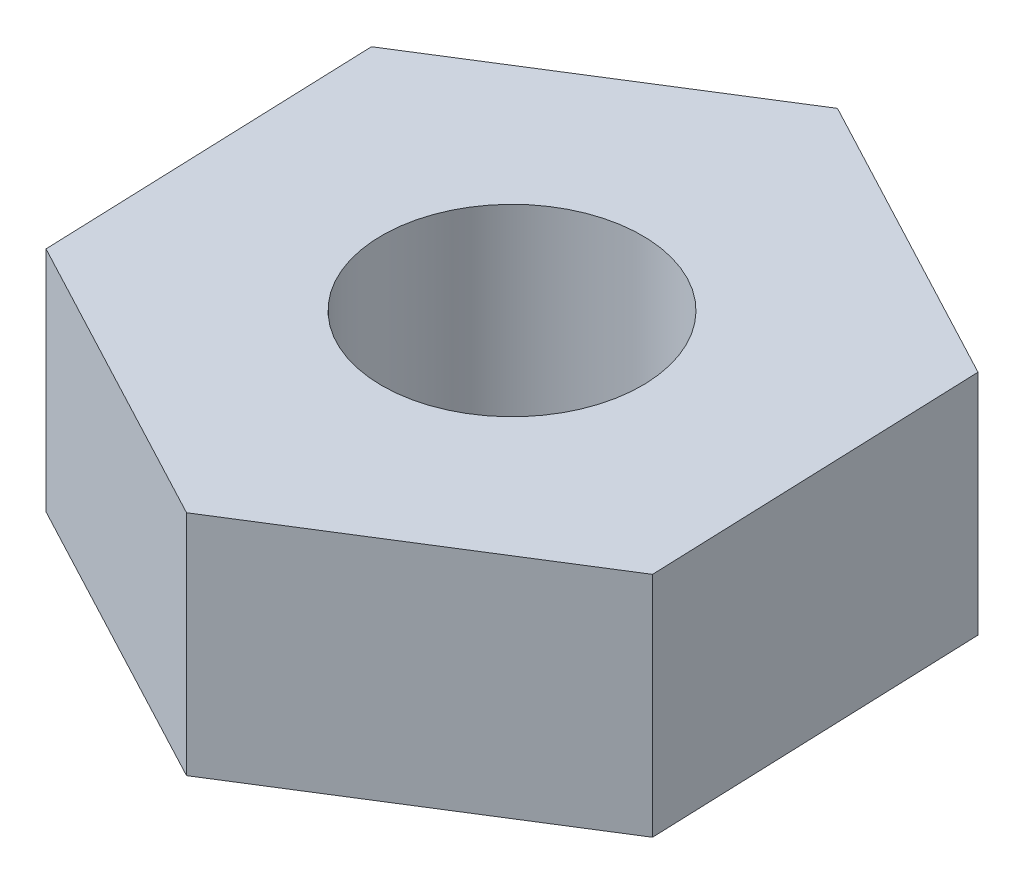
ISO-10303-21;
HEADER;
FILE_DESCRIPTION(('STEP AP214'),'2;1');
FILE_NAME('part.step','',(''),(''),'','','');
FILE_SCHEMA(('AUTOMOTIVE_DESIGN { 1 0 10303 214 1 1 1 1 }'));
ENDSEC;
DATA;
#1=APPLICATION_CONTEXT('core data for automotive mechanical design processes');
#2=APPLICATION_PROTOCOL_DEFINITION('international standard','automotive_design',2000,#1);
#3=PRODUCT_CONTEXT('',#1,'mechanical');
#4=PRODUCT('Part','Part','',(#3));
#5=PRODUCT_RELATED_PRODUCT_CATEGORY('part','',(#4));
#6=PRODUCT_DEFINITION_FORMATION('','',#4);
#7=PRODUCT_DEFINITION_CONTEXT('part definition',#1,'design');
#8=PRODUCT_DEFINITION('design','',#6,#7);
#9=PRODUCT_DEFINITION_SHAPE('','',#8);
#10=(LENGTH_UNIT() NAMED_UNIT(*) SI_UNIT(.MILLI.,.METRE.));
#11=(NAMED_UNIT(*) PLANE_ANGLE_UNIT() SI_UNIT($,.RADIAN.));
#12=(NAMED_UNIT(*) SI_UNIT($,.STERADIAN.) SOLID_ANGLE_UNIT());
#13=UNCERTAINTY_MEASURE_WITH_UNIT(LENGTH_MEASURE(1.E-05),#10,'distance_accuracy_value','');
#14=(GEOMETRIC_REPRESENTATION_CONTEXT(3) GLOBAL_UNCERTAINTY_ASSIGNED_CONTEXT((#13)) GLOBAL_UNIT_ASSIGNED_CONTEXT((#10,
#11,#12)) REPRESENTATION_CONTEXT('',''));
#15=CARTESIAN_POINT('',(0.,0.,0.));
#16=DIRECTION('',(0.,0.,1.));
#17=DIRECTION('',(1.,0.,0.));
#18=AXIS2_PLACEMENT_3D('',#15,#16,#17);
#19=CARTESIAN_POINT('',(0.,1.75,0.));
#20=DIRECTION('',(0.,1.,0.));
#21=DIRECTION('',(0.,0.,1.));
#22=AXIS2_PLACEMENT_3D('',#19,#20,#21);
#23=PLANE('',#22);
#24=DIRECTION('',(0.847163633687785,0.,-0.53133207860707));
#25=VECTOR('',#24,1.);
#26=CARTESIAN_POINT('',(0.0949993349619725,1.75,2.59633879267648));
#27=LINE('',#26,#25);
#28=CARTESIAN_POINT('',(0.0949993349619725,1.75,2.59633879267648));
#29=VERTEX_POINT('',#28);
#30=CARTESIAN_POINT('',(2.29599501876984,1.75,1.21589755891855));
#31=VERTEX_POINT('',#30);
#32=EDGE_CURVE('E100',#29,#31,#27,.T.);
#33=ORIENTED_EDGE('',*,*,#32,.T.);
#34=DIRECTION('',(-0.0365652610754204,0.,-0.999331267239491));
#35=VECTOR('',#34,1.);
#36=CARTESIAN_POINT('',(2.29599501876984,1.75,1.21589755891855));
#37=LINE('',#36,#35);
#38=CARTESIAN_POINT('',(2.20099568380787,1.75,-1.38044123375794));
#39=VERTEX_POINT('',#38);
#40=EDGE_CURVE('E53',#31,#39,#37,.T.);
#41=ORIENTED_EDGE('',*,*,#40,.T.);
#42=DIRECTION('',(-0.883728894763205,0.,-0.467999188632421));
#43=VECTOR('',#42,1.);
#44=CARTESIAN_POINT('',(2.20099568380787,1.75,-1.38044123375794));
#45=LINE('',#44,#43);
#46=CARTESIAN_POINT('',(-0.0949993349619726,1.75,-2.59633879267648));
#47=VERTEX_POINT('',#46);
#48=EDGE_CURVE('E88',#39,#47,#45,.T.);
#49=ORIENTED_EDGE('',*,*,#48,.T.);
#50=DIRECTION('',(-0.847163633687784,0.,0.53133207860707));
#51=VECTOR('',#50,1.);
#52=CARTESIAN_POINT('',(-0.0949993349619726,1.75,-2.59633879267648));
#53=LINE('',#52,#51);
#54=CARTESIAN_POINT('',(-2.29599501876984,1.75,-1.21589755891855));
#55=VERTEX_POINT('',#54);
#56=EDGE_CURVE('E219',#47,#55,#53,.T.);
#57=ORIENTED_EDGE('',*,*,#56,.T.);
#58=DIRECTION('',(0.0365652610754201,0.,0.999331267239491));
#59=VECTOR('',#58,1.);
#60=CARTESIAN_POINT('',(-2.29599501876984,1.75,-1.21589755891855));
#61=LINE('',#60,#59);
#62=CARTESIAN_POINT('',(-2.20099568380787,1.75,1.38044123375794));
#63=VERTEX_POINT('',#62);
#64=EDGE_CURVE('E102',#55,#63,#61,.T.);
#65=ORIENTED_EDGE('',*,*,#64,.T.);
#66=DIRECTION('',(0.883728894763205,0.,0.467999188632421));
#67=VECTOR('',#66,1.);
#68=CARTESIAN_POINT('',(-2.20099568380787,1.75,1.38044123375794));
#69=LINE('',#68,#67);
#70=EDGE_CURVE('E96',#63,#29,#69,.T.);
#71=ORIENTED_EDGE('',*,*,#70,.T.);
#72=EDGE_LOOP('',(#33,#41,#49,#57,#65,#71));
#73=FACE_BOUND('',#72,.T.);
#74=CARTESIAN_POINT('',(0.,1.75,0.));
#75=DIRECTION('',(0.,1.,0.));
#76=DIRECTION('',(0.,0.,1.));
#77=AXIS2_PLACEMENT_3D('',#74,#75,#76);
#78=CIRCLE('',#77,1.);
#79=CARTESIAN_POINT('',(0.,1.75,1.));
#80=VERTEX_POINT('',#79);
#81=EDGE_CURVE('E124',#80,#80,#78,.T.);
#82=ORIENTED_EDGE('',*,*,#81,.F.);
#83=EDGE_LOOP('',(#82));
#84=FACE_BOUND('',#83,.T.);
#85=ADVANCED_FACE('F36',(#73,#84),#23,.T.);
#86=CARTESIAN_POINT('',(0.,0.,0.));
#87=DIRECTION('',(0.,1.,0.));
#88=DIRECTION('',(0.,0.,1.));
#89=AXIS2_PLACEMENT_3D('',#86,#87,#88);
#90=PLANE('',#89);
#91=DIRECTION('',(-0.883728894763205,0.,-0.467999188632421));
#92=VECTOR('',#91,1.);
#93=CARTESIAN_POINT('',(2.20099568380787,0.,-1.38044123375794));
#94=LINE('',#93,#92);
#95=CARTESIAN_POINT('',(2.20099568380787,0.,-1.38044123375794));
#96=VERTEX_POINT('',#95);
#97=CARTESIAN_POINT('',(-0.0949993349619726,0.,-2.59633879267648));
#98=VERTEX_POINT('',#97);
#99=EDGE_CURVE('E120',#96,#98,#94,.T.);
#100=ORIENTED_EDGE('',*,*,#99,.F.);
#101=DIRECTION('',(-0.0365652610754204,0.,-0.999331267239491));
#102=VECTOR('',#101,1.);
#103=CARTESIAN_POINT('',(2.29599501876984,0.,1.21589755891855));
#104=LINE('',#103,#102);
#105=CARTESIAN_POINT('',(2.29599501876984,0.,1.21589755891855));
#106=VERTEX_POINT('',#105);
#107=EDGE_CURVE('E82',#106,#96,#104,.T.);
#108=ORIENTED_EDGE('',*,*,#107,.F.);
#109=DIRECTION('',(0.847163633687785,0.,-0.53133207860707));
#110=VECTOR('',#109,1.);
#111=CARTESIAN_POINT('',(0.0949993349619725,0.,2.59633879267648));
#112=LINE('',#111,#110);
#113=CARTESIAN_POINT('',(0.0949993349619725,0.,2.59633879267648));
#114=VERTEX_POINT('',#113);
#115=EDGE_CURVE('E76',#114,#106,#112,.T.);
#116=ORIENTED_EDGE('',*,*,#115,.F.);
#117=DIRECTION('',(0.883728894763205,0.,0.467999188632421));
#118=VECTOR('',#117,1.);
#119=CARTESIAN_POINT('',(-2.20099568380787,0.,1.38044123375794));
#120=LINE('',#119,#118);
#121=CARTESIAN_POINT('',(-2.20099568380787,0.,1.38044123375794));
#122=VERTEX_POINT('',#121);
#123=EDGE_CURVE('E110',#122,#114,#120,.T.);
#124=ORIENTED_EDGE('',*,*,#123,.F.);
#125=DIRECTION('',(0.0365652610754201,0.,0.999331267239491));
#126=VECTOR('',#125,1.);
#127=CARTESIAN_POINT('',(-2.29599501876984,0.,-1.21589755891855));
#128=LINE('',#127,#126);
#129=CARTESIAN_POINT('',(-2.29599501876984,0.,-1.21589755891855));
#130=VERTEX_POINT('',#129);
#131=EDGE_CURVE('E126',#130,#122,#128,.T.);
#132=ORIENTED_EDGE('',*,*,#131,.F.);
#133=DIRECTION('',(-0.847163633687784,0.,0.53133207860707));
#134=VECTOR('',#133,1.);
#135=CARTESIAN_POINT('',(-0.0949993349619726,0.,-2.59633879267648));
#136=LINE('',#135,#134);
#137=EDGE_CURVE('E123',#98,#130,#136,.T.);
#138=ORIENTED_EDGE('',*,*,#137,.F.);
#139=EDGE_LOOP('',(#100,#108,#116,#124,#132,#138));
#140=FACE_BOUND('',#139,.T.);
#141=CARTESIAN_POINT('',(0.,0.,0.));
#142=DIRECTION('',(0.,1.,0.));
#143=DIRECTION('',(0.,0.,1.));
#144=AXIS2_PLACEMENT_3D('',#141,#142,#143);
#145=CIRCLE('',#144,1.);
#146=CARTESIAN_POINT('',(0.,0.,1.));
#147=VERTEX_POINT('',#146);
#148=EDGE_CURVE('E223',#147,#147,#145,.T.);
#149=ORIENTED_EDGE('',*,*,#148,.T.);
#150=EDGE_LOOP('',(#149));
#151=FACE_BOUND('',#150,.T.);
#152=ADVANCED_FACE('F141',(#140,#151),#90,.F.);
#153=CARTESIAN_POINT('',(2.20099568380787,1.75,-1.38044123375794));
#154=DIRECTION('',(-0.467999188632421,0.,0.883728894763205));
#155=DIRECTION('',(0.883728894763205,0.,0.467999188632421));
#156=AXIS2_PLACEMENT_3D('',#153,#154,#155);
#157=PLANE('',#156);
#158=ORIENTED_EDGE('',*,*,#99,.T.);
#159=DIRECTION('',(0.,-1.,0.));
#160=VECTOR('',#159,1.);
#161=CARTESIAN_POINT('',(-0.0949993349619726,1.75,-2.59633879267648));
#162=LINE('',#161,#160);
#163=EDGE_CURVE('E11',#47,#98,#162,.T.);
#164=ORIENTED_EDGE('',*,*,#163,.F.);
#165=ORIENTED_EDGE('',*,*,#48,.F.);
#166=DIRECTION('',(0.,-1.,0.));
#167=VECTOR('',#166,1.);
#168=CARTESIAN_POINT('',(2.20099568380787,1.75,-1.38044123375794));
#169=LINE('',#168,#167);
#170=EDGE_CURVE('E116',#39,#96,#169,.T.);
#171=ORIENTED_EDGE('',*,*,#170,.T.);
#172=EDGE_LOOP('',(#158,#164,#165,#171));
#173=FACE_BOUND('',#172,.T.);
#174=ADVANCED_FACE('F38',(#173),#157,.F.);
#175=CARTESIAN_POINT('',(-0.0949993349619726,1.75,-2.59633879267648));
#176=DIRECTION('',(0.53133207860707,0.,0.847163633687785));
#177=DIRECTION('',(0.847163633687785,0.,-0.53133207860707));
#178=AXIS2_PLACEMENT_3D('',#175,#176,#177);
#179=PLANE('',#178);
#180=ORIENTED_EDGE('',*,*,#137,.T.);
#181=DIRECTION('',(0.,-1.,0.));
#182=VECTOR('',#181,1.);
#183=CARTESIAN_POINT('',(-2.29599501876984,1.75,-1.21589755891855));
#184=LINE('',#183,#182);
#185=EDGE_CURVE('E45',#55,#130,#184,.T.);
#186=ORIENTED_EDGE('',*,*,#185,.F.);
#187=ORIENTED_EDGE('',*,*,#56,.F.);
#188=ORIENTED_EDGE('',*,*,#163,.T.);
#189=EDGE_LOOP('',(#180,#186,#187,#188));
#190=FACE_BOUND('',#189,.T.);
#191=ADVANCED_FACE('F165',(#190),#179,.F.);
#192=CARTESIAN_POINT('',(-2.29599501876984,1.75,-1.21589755891855));
#193=DIRECTION('',(0.999331267239491,0.,-0.0365652610754201));
#194=DIRECTION('',(-0.0365652610754201,0.,-0.999331267239491));
#195=AXIS2_PLACEMENT_3D('',#192,#193,#194);
#196=PLANE('',#195);
#197=ORIENTED_EDGE('',*,*,#131,.T.);
#198=DIRECTION('',(0.,-1.,0.));
#199=VECTOR('',#198,1.);
#200=CARTESIAN_POINT('',(-2.20099568380787,1.75,1.38044123375794));
#201=LINE('',#200,#199);
#202=EDGE_CURVE('E111',#63,#122,#201,.T.);
#203=ORIENTED_EDGE('',*,*,#202,.F.);
#204=ORIENTED_EDGE('',*,*,#64,.F.);
#205=ORIENTED_EDGE('',*,*,#185,.T.);
#206=EDGE_LOOP('',(#197,#203,#204,#205));
#207=FACE_BOUND('',#206,.T.);
#208=ADVANCED_FACE('F137',(#207),#196,.F.);
#209=CARTESIAN_POINT('',(-2.20099568380787,1.75,1.38044123375794));
#210=DIRECTION('',(0.467999188632421,0.,-0.883728894763205));
#211=DIRECTION('',(-0.883728894763205,0.,-0.467999188632421));
#212=AXIS2_PLACEMENT_3D('',#209,#210,#211);
#213=PLANE('',#212);
#214=ORIENTED_EDGE('',*,*,#123,.T.);
#215=DIRECTION('',(0.,-1.,0.));
#216=VECTOR('',#215,1.);
#217=CARTESIAN_POINT('',(0.0949993349619725,1.75,2.59633879267648));
#218=LINE('',#217,#216);
#219=EDGE_CURVE('E107',#29,#114,#218,.T.);
#220=ORIENTED_EDGE('',*,*,#219,.F.);
#221=ORIENTED_EDGE('',*,*,#70,.F.);
#222=ORIENTED_EDGE('',*,*,#202,.T.);
#223=EDGE_LOOP('',(#214,#220,#221,#222));
#224=FACE_BOUND('',#223,.T.);
#225=ADVANCED_FACE('F108',(#224),#213,.F.);
#226=CARTESIAN_POINT('',(0.0949993349619725,1.75,2.59633879267648));
#227=DIRECTION('',(-0.531332078607069,0.,-0.847163633687785));
#228=DIRECTION('',(-0.847163633687785,0.,0.53133207860707));
#229=AXIS2_PLACEMENT_3D('',#226,#227,#228);
#230=PLANE('',#229);
#231=ORIENTED_EDGE('',*,*,#115,.T.);
#232=DIRECTION('',(0.,-1.,0.));
#233=VECTOR('',#232,1.);
#234=CARTESIAN_POINT('',(2.29599501876984,1.75,1.21589755891855));
#235=LINE('',#234,#233);
#236=EDGE_CURVE('E112',#31,#106,#235,.T.);
#237=ORIENTED_EDGE('',*,*,#236,.F.);
#238=ORIENTED_EDGE('',*,*,#32,.F.);
#239=ORIENTED_EDGE('',*,*,#219,.T.);
#240=EDGE_LOOP('',(#231,#237,#238,#239));
#241=FACE_BOUND('',#240,.T.);
#242=ADVANCED_FACE('F114',(#241),#230,.F.);
#243=CARTESIAN_POINT('',(2.29599501876984,1.75,1.21589755891855));
#244=DIRECTION('',(-0.999331267239491,0.,0.0365652610754204));
#245=DIRECTION('',(0.0365652610754204,0.,0.999331267239491));
#246=AXIS2_PLACEMENT_3D('',#243,#244,#245);
#247=PLANE('',#246);
#248=ORIENTED_EDGE('',*,*,#107,.T.);
#249=ORIENTED_EDGE('',*,*,#170,.F.);
#250=ORIENTED_EDGE('',*,*,#40,.F.);
#251=ORIENTED_EDGE('',*,*,#236,.T.);
#252=EDGE_LOOP('',(#248,#249,#250,#251));
#253=FACE_BOUND('',#252,.T.);
#254=ADVANCED_FACE('F145',(#253),#247,.F.);
#255=CARTESIAN_POINT('',(0.,1.75,0.));
#256=DIRECTION('',(0.,-1.,0.));
#257=DIRECTION('',(0.,0.,-1.));
#258=AXIS2_PLACEMENT_3D('',#255,#256,#257);
#259=CYLINDRICAL_SURFACE('',#258,1.);
#260=ORIENTED_EDGE('',*,*,#81,.T.);
#261=EDGE_LOOP('',(#260));
#262=FACE_BOUND('',#261,.T.);
#263=ORIENTED_EDGE('',*,*,#148,.F.);
#264=EDGE_LOOP('',(#263));
#265=FACE_BOUND('',#264,.T.);
#266=ADVANCED_FACE('F147',(#262,#265),#259,.F.);
#267=CLOSED_SHELL('',(#85,#152,#174,#191,#208,#225,#242,#254,#266));
#268=MANIFOLD_SOLID_BREP('B2',#267);
#269=ADVANCED_BREP_SHAPE_REPRESENTATION('',(#18,#268),#14);
#270=SHAPE_DEFINITION_REPRESENTATION(#9,#269);
ENDSEC;
END-ISO-10303-21;
